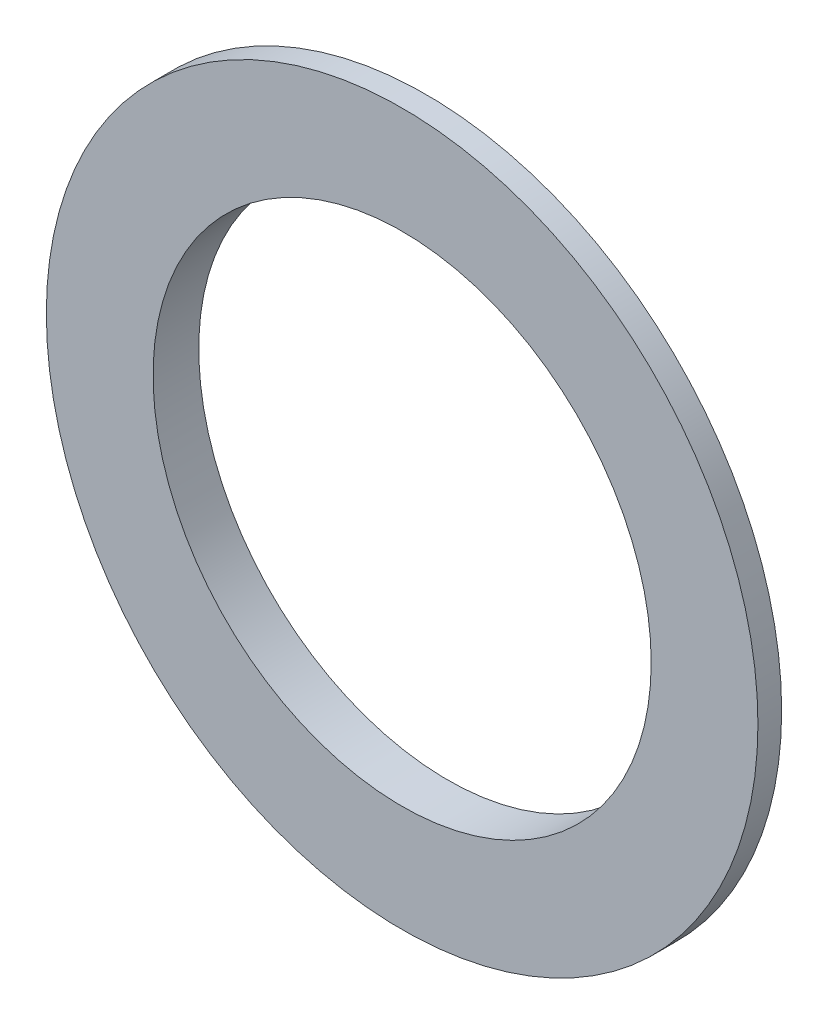
ISO-10303-21;
HEADER;
FILE_DESCRIPTION(('STEP AP214'),'2;1');
FILE_NAME('part.step','',(''),(''),'','','');
FILE_SCHEMA(('AUTOMOTIVE_DESIGN { 1 0 10303 214 1 1 1 1 }'));
ENDSEC;
DATA;
#1=APPLICATION_CONTEXT('core data for automotive mechanical design processes');
#2=APPLICATION_PROTOCOL_DEFINITION('international standard','automotive_design',2000,#1);
#3=PRODUCT_CONTEXT('',#1,'mechanical');
#4=PRODUCT('Part','Part','',(#3));
#5=PRODUCT_RELATED_PRODUCT_CATEGORY('part','',(#4));
#6=PRODUCT_DEFINITION_FORMATION('','',#4);
#7=PRODUCT_DEFINITION_CONTEXT('part definition',#1,'design');
#8=PRODUCT_DEFINITION('design','',#6,#7);
#9=PRODUCT_DEFINITION_SHAPE('','',#8);
#10=(LENGTH_UNIT() NAMED_UNIT(*) SI_UNIT(.MILLI.,.METRE.));
#11=(NAMED_UNIT(*) PLANE_ANGLE_UNIT() SI_UNIT($,.RADIAN.));
#12=(NAMED_UNIT(*) SI_UNIT($,.STERADIAN.) SOLID_ANGLE_UNIT());
#13=UNCERTAINTY_MEASURE_WITH_UNIT(LENGTH_MEASURE(1.E-05),#10,'distance_accuracy_value','');
#14=(GEOMETRIC_REPRESENTATION_CONTEXT(3) GLOBAL_UNCERTAINTY_ASSIGNED_CONTEXT((#13)) GLOBAL_UNIT_ASSIGNED_CONTEXT((#10,
#11,#12)) REPRESENTATION_CONTEXT('',''));
#15=CARTESIAN_POINT('',(0.,0.,0.));
#16=DIRECTION('',(0.,0.,1.));
#17=DIRECTION('',(1.,0.,0.));
#18=AXIS2_PLACEMENT_3D('',#15,#16,#17);
#19=CARTESIAN_POINT('',(0.,0.,0.));
#20=DIRECTION('',(0.,0.,1.));
#21=DIRECTION('',(1.,0.,0.));
#22=AXIS2_PLACEMENT_3D('',#19,#20,#21);
#23=PLANE('',#22);
#24=CARTESIAN_POINT('',(0.,0.,0.));
#25=DIRECTION('',(0.,0.,1.));
#26=DIRECTION('',(1.,0.,0.));
#27=AXIS2_PLACEMENT_3D('',#24,#25,#26);
#28=CIRCLE('',#27,22.35);
#29=CARTESIAN_POINT('',(22.35,0.,0.));
#30=VERTEX_POINT('',#29);
#31=EDGE_CURVE('E45',#30,#30,#28,.T.);
#32=ORIENTED_EDGE('',*,*,#31,.F.);
#33=EDGE_LOOP('',(#32));
#34=FACE_BOUND('',#33,.T.);
#35=CARTESIAN_POINT('',(0.,0.,0.));
#36=DIRECTION('',(0.,0.,1.));
#37=DIRECTION('',(1.,0.,0.));
#38=AXIS2_PLACEMENT_3D('',#35,#36,#37);
#39=CIRCLE('',#38,21.);
#40=CARTESIAN_POINT('',(21.,0.,0.));
#41=VERTEX_POINT('',#40);
#42=EDGE_CURVE('E52',#41,#41,#39,.T.);
#43=ORIENTED_EDGE('',*,*,#42,.T.);
#44=EDGE_LOOP('',(#43));
#45=FACE_BOUND('',#44,.T.);
#46=ADVANCED_FACE('F41',(#34,#45),#23,.F.);
#47=CARTESIAN_POINT('',(0.,0.,1.85));
#48=DIRECTION('',(0.,0.,-1.));
#49=DIRECTION('',(-1.,0.,0.));
#50=AXIS2_PLACEMENT_3D('',#47,#48,#49);
#51=CYLINDRICAL_SURFACE('',#50,22.35);
#52=CARTESIAN_POINT('',(0.,0.,1.85));
#53=DIRECTION('',(0.,0.,1.));
#54=DIRECTION('',(1.,0.,0.));
#55=AXIS2_PLACEMENT_3D('',#52,#53,#54);
#56=CIRCLE('',#55,22.35);
#57=CARTESIAN_POINT('',(22.35,0.,1.85));
#58=VERTEX_POINT('',#57);
#59=EDGE_CURVE('E10',#58,#58,#56,.T.);
#60=ORIENTED_EDGE('',*,*,#59,.F.);
#61=EDGE_LOOP('',(#60));
#62=FACE_BOUND('',#61,.T.);
#63=ORIENTED_EDGE('',*,*,#31,.T.);
#64=EDGE_LOOP('',(#63));
#65=FACE_BOUND('',#64,.T.);
#66=ADVANCED_FACE('F43',(#62,#65),#51,.T.);
#67=CARTESIAN_POINT('',(0.,0.,1.85));
#68=DIRECTION('',(0.,0.,-1.));
#69=DIRECTION('',(-1.,0.,0.));
#70=AXIS2_PLACEMENT_3D('',#67,#68,#69);
#71=CYLINDRICAL_SURFACE('',#70,21.);
#72=ORIENTED_EDGE('',*,*,#42,.F.);
#73=EDGE_LOOP('',(#72));
#74=FACE_BOUND('',#73,.T.);
#75=CARTESIAN_POINT('',(0.,0.,3.85));
#76=DIRECTION('',(0.,0.,1.));
#77=DIRECTION('',(1.,0.,0.));
#78=AXIS2_PLACEMENT_3D('',#75,#76,#77);
#79=CIRCLE('',#78,21.);
#80=CARTESIAN_POINT('',(21.,0.,3.85));
#81=VERTEX_POINT('',#80);
#82=EDGE_CURVE('E60',#81,#81,#79,.T.);
#83=ORIENTED_EDGE('',*,*,#82,.T.);
#84=EDGE_LOOP('',(#83));
#85=FACE_BOUND('',#84,.T.);
#86=ADVANCED_FACE('F66',(#74,#85),#71,.F.);
#87=CARTESIAN_POINT('',(0.,0.,3.85));
#88=DIRECTION('',(0.,0.,1.));
#89=DIRECTION('',(1.,0.,0.));
#90=AXIS2_PLACEMENT_3D('',#87,#88,#89);
#91=PLANE('',#90);
#92=CARTESIAN_POINT('',(0.,0.,3.85));
#93=DIRECTION('',(0.,0.,1.));
#94=DIRECTION('',(1.,0.,0.));
#95=AXIS2_PLACEMENT_3D('',#92,#93,#94);
#96=CIRCLE('',#95,30.);
#97=CARTESIAN_POINT('',(30.,0.,3.85));
#98=VERTEX_POINT('',#97);
#99=EDGE_CURVE('E56',#98,#98,#96,.T.);
#100=ORIENTED_EDGE('',*,*,#99,.T.);
#101=EDGE_LOOP('',(#100));
#102=FACE_BOUND('',#101,.T.);
#103=ORIENTED_EDGE('',*,*,#82,.F.);
#104=EDGE_LOOP('',(#103));
#105=FACE_BOUND('',#104,.T.);
#106=ADVANCED_FACE('F68',(#102,#105),#91,.T.);
#107=CARTESIAN_POINT('',(0.,0.,1.85));
#108=DIRECTION('',(0.,0.,1.));
#109=DIRECTION('',(1.,0.,0.));
#110=AXIS2_PLACEMENT_3D('',#107,#108,#109);
#111=PLANE('',#110);
#112=ORIENTED_EDGE('',*,*,#59,.T.);
#113=EDGE_LOOP('',(#112));
#114=FACE_BOUND('',#113,.T.);
#115=CARTESIAN_POINT('',(0.,0.,1.85));
#116=DIRECTION('',(0.,0.,1.));
#117=DIRECTION('',(1.,0.,0.));
#118=AXIS2_PLACEMENT_3D('',#115,#116,#117);
#119=CIRCLE('',#118,30.);
#120=CARTESIAN_POINT('',(30.,0.,1.85));
#121=VERTEX_POINT('',#120);
#122=EDGE_CURVE('E57',#121,#121,#119,.T.);
#123=ORIENTED_EDGE('',*,*,#122,.F.);
#124=EDGE_LOOP('',(#123));
#125=FACE_BOUND('',#124,.T.);
#126=ADVANCED_FACE('F70',(#114,#125),#111,.F.);
#127=CARTESIAN_POINT('',(0.,0.,3.85));
#128=DIRECTION('',(0.,0.,-1.));
#129=DIRECTION('',(-1.,0.,0.));
#130=AXIS2_PLACEMENT_3D('',#127,#128,#129);
#131=CYLINDRICAL_SURFACE('',#130,30.);
#132=ORIENTED_EDGE('',*,*,#99,.F.);
#133=EDGE_LOOP('',(#132));
#134=FACE_BOUND('',#133,.T.);
#135=ORIENTED_EDGE('',*,*,#122,.T.);
#136=EDGE_LOOP('',(#135));
#137=FACE_BOUND('',#136,.T.);
#138=ADVANCED_FACE('F77',(#134,#137),#131,.T.);
#139=CLOSED_SHELL('',(#46,#66,#86,#106,#126,#138));
#140=MANIFOLD_SOLID_BREP('B2',#139);
#141=ADVANCED_BREP_SHAPE_REPRESENTATION('',(#18,#140),#14);
#142=SHAPE_DEFINITION_REPRESENTATION(#9,#141);
ENDSEC;
END-ISO-10303-21;
